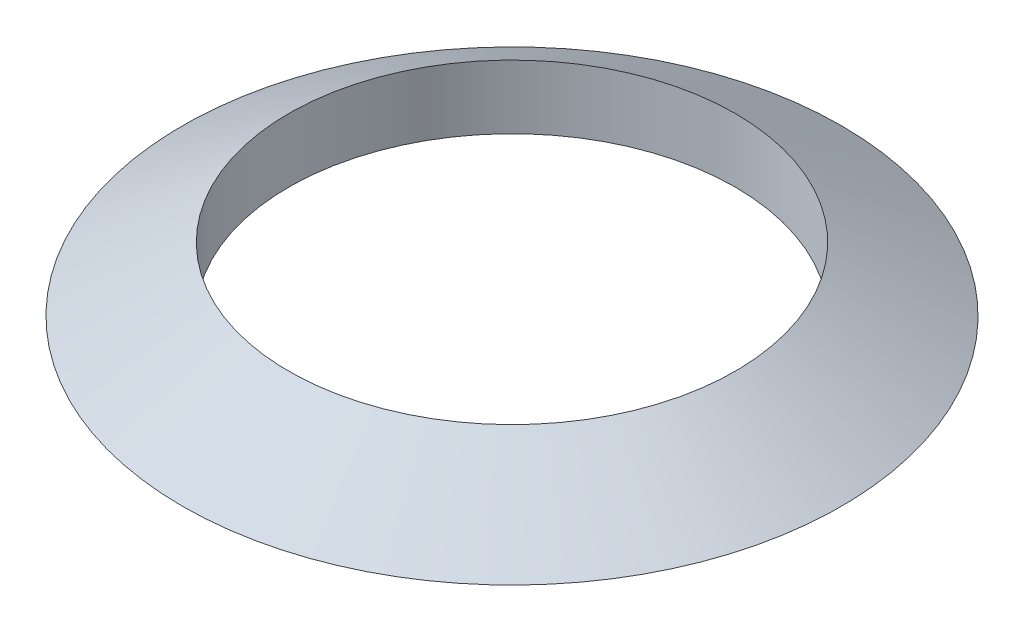
ISO-10303-21;
HEADER;
FILE_DESCRIPTION(('STEP AP214'),'2;1');
FILE_NAME('part.step','',(''),(''),'','','');
FILE_SCHEMA(('AUTOMOTIVE_DESIGN { 1 0 10303 214 1 1 1 1 }'));
ENDSEC;
DATA;
#1=APPLICATION_CONTEXT('core data for automotive mechanical design processes');
#2=APPLICATION_PROTOCOL_DEFINITION('international standard','automotive_design',2000,#1);
#3=PRODUCT_CONTEXT('',#1,'mechanical');
#4=PRODUCT('Part','Part','',(#3));
#5=PRODUCT_RELATED_PRODUCT_CATEGORY('part','',(#4));
#6=PRODUCT_DEFINITION_FORMATION('','',#4);
#7=PRODUCT_DEFINITION_CONTEXT('part definition',#1,'design');
#8=PRODUCT_DEFINITION('design','',#6,#7);
#9=PRODUCT_DEFINITION_SHAPE('','',#8);
#10=(LENGTH_UNIT() NAMED_UNIT(*) SI_UNIT(.MILLI.,.METRE.));
#11=(NAMED_UNIT(*) PLANE_ANGLE_UNIT() SI_UNIT($,.RADIAN.));
#12=(NAMED_UNIT(*) SI_UNIT($,.STERADIAN.) SOLID_ANGLE_UNIT());
#13=UNCERTAINTY_MEASURE_WITH_UNIT(LENGTH_MEASURE(1.E-05),#10,'distance_accuracy_value','');
#14=(GEOMETRIC_REPRESENTATION_CONTEXT(3) GLOBAL_UNCERTAINTY_ASSIGNED_CONTEXT((#13)) GLOBAL_UNIT_ASSIGNED_CONTEXT((#10,
#11,#12)) REPRESENTATION_CONTEXT('',''));
#15=CARTESIAN_POINT('',(0.,0.,0.));
#16=DIRECTION('',(0.,0.,1.));
#17=DIRECTION('',(1.,0.,0.));
#18=AXIS2_PLACEMENT_3D('',#15,#16,#17);
#19=CARTESIAN_POINT('',(0.,30.,0.));
#20=DIRECTION('',(0.,-1.,0.));
#21=DIRECTION('',(0.,0.,-1.));
#22=AXIS2_PLACEMENT_3D('',#19,#20,#21);
#23=CONICAL_SURFACE('',#22,105.,1.03037682652431);
#24=CARTESIAN_POINT('',(0.,0.,0.));
#25=DIRECTION('',(0.,-1.,0.));
#26=DIRECTION('',(0.,0.,-1.));
#27=AXIS2_PLACEMENT_3D('',#24,#25,#26);
#28=CIRCLE('',#27,155.);
#29=CARTESIAN_POINT('',(0.,0.,-155.));
#30=VERTEX_POINT('',#29);
#31=EDGE_CURVE('E10',#30,#30,#28,.T.);
#32=ORIENTED_EDGE('',*,*,#31,.F.);
#33=EDGE_LOOP('',(#32));
#34=FACE_BOUND('',#33,.T.);
#35=CARTESIAN_POINT('',(0.,30.,0.));
#36=DIRECTION('',(0.,-1.,0.));
#37=DIRECTION('',(0.,0.,-1.));
#38=AXIS2_PLACEMENT_3D('',#35,#36,#37);
#39=CIRCLE('',#38,105.);
#40=CARTESIAN_POINT('',(0.,30.,-105.));
#41=VERTEX_POINT('',#40);
#42=EDGE_CURVE('E47',#41,#41,#39,.T.);
#43=ORIENTED_EDGE('',*,*,#42,.T.);
#44=EDGE_LOOP('',(#43));
#45=FACE_BOUND('',#44,.T.);
#46=ADVANCED_FACE('F37',(#34,#45),#23,.T.);
#47=CARTESIAN_POINT('',(-155.,0.,0.));
#48=DIRECTION('',(0.,1.,0.));
#49=DIRECTION('',(0.,0.,1.));
#50=AXIS2_PLACEMENT_3D('',#47,#48,#49);
#51=PLANE('',#50);
#52=CARTESIAN_POINT('',(0.,0.,0.));
#53=DIRECTION('',(0.,-1.,0.));
#54=DIRECTION('',(0.,0.,-1.));
#55=AXIS2_PLACEMENT_3D('',#52,#53,#54);
#56=CIRCLE('',#55,105.);
#57=CARTESIAN_POINT('',(0.,0.,-105.));
#58=VERTEX_POINT('',#57);
#59=EDGE_CURVE('E43',#58,#58,#56,.T.);
#60=ORIENTED_EDGE('',*,*,#59,.F.);
#61=EDGE_LOOP('',(#60));
#62=FACE_BOUND('',#61,.T.);
#63=ORIENTED_EDGE('',*,*,#31,.T.);
#64=EDGE_LOOP('',(#63));
#65=FACE_BOUND('',#64,.T.);
#66=ADVANCED_FACE('F57',(#62,#65),#51,.F.);
#67=CARTESIAN_POINT('',(0.,0.,0.));
#68=DIRECTION('',(0.,-1.,0.));
#69=DIRECTION('',(0.,0.,-1.));
#70=AXIS2_PLACEMENT_3D('',#67,#68,#69);
#71=CYLINDRICAL_SURFACE('',#70,105.);
#72=ORIENTED_EDGE('',*,*,#42,.F.);
#73=EDGE_LOOP('',(#72));
#74=FACE_BOUND('',#73,.T.);
#75=ORIENTED_EDGE('',*,*,#59,.T.);
#76=EDGE_LOOP('',(#75));
#77=FACE_BOUND('',#76,.T.);
#78=ADVANCED_FACE('F55',(#74,#77),#71,.F.);
#79=CLOSED_SHELL('',(#46,#66,#78));
#80=MANIFOLD_SOLID_BREP('B2',#79);
#81=ADVANCED_BREP_SHAPE_REPRESENTATION('',(#18,#80),#14);
#82=SHAPE_DEFINITION_REPRESENTATION(#9,#81);
ENDSEC;
END-ISO-10303-21;
